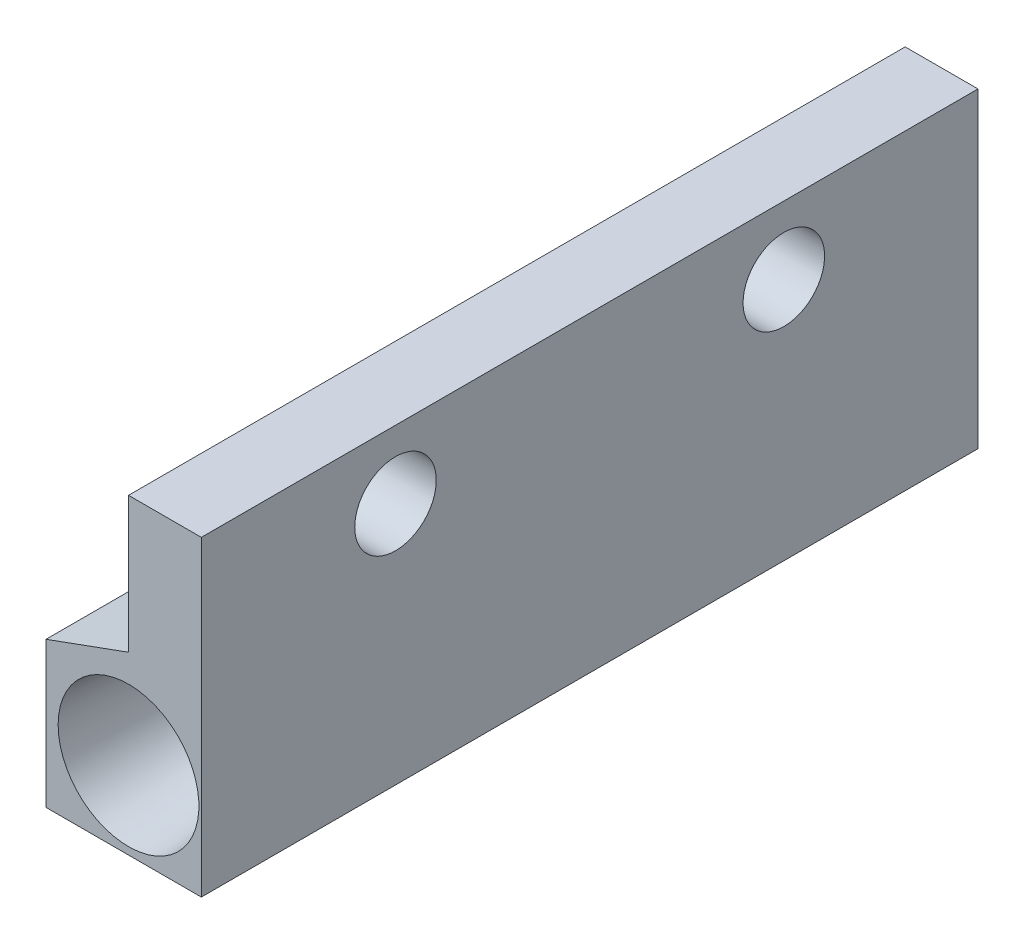
ISO-10303-21;
HEADER;
FILE_DESCRIPTION(('STEP AP214'),'2;1');
FILE_NAME('part.step','',(''),(''),'','','');
FILE_SCHEMA(('AUTOMOTIVE_DESIGN { 1 0 10303 214 1 1 1 1 }'));
ENDSEC;
DATA;
#1=APPLICATION_CONTEXT('core data for automotive mechanical design processes');
#2=APPLICATION_PROTOCOL_DEFINITION('international standard','automotive_design',2000,#1);
#3=PRODUCT_CONTEXT('',#1,'mechanical');
#4=PRODUCT('Part','Part','',(#3));
#5=PRODUCT_RELATED_PRODUCT_CATEGORY('part','',(#4));
#6=PRODUCT_DEFINITION_FORMATION('','',#4);
#7=PRODUCT_DEFINITION_CONTEXT('part definition',#1,'design');
#8=PRODUCT_DEFINITION('design','',#6,#7);
#9=PRODUCT_DEFINITION_SHAPE('','',#8);
#10=(LENGTH_UNIT() NAMED_UNIT(*) SI_UNIT(.MILLI.,.METRE.));
#11=(NAMED_UNIT(*) PLANE_ANGLE_UNIT() SI_UNIT($,.RADIAN.));
#12=(NAMED_UNIT(*) SI_UNIT($,.STERADIAN.) SOLID_ANGLE_UNIT());
#13=UNCERTAINTY_MEASURE_WITH_UNIT(LENGTH_MEASURE(1.E-05),#10,'distance_accuracy_value','');
#14=(GEOMETRIC_REPRESENTATION_CONTEXT(3) GLOBAL_UNCERTAINTY_ASSIGNED_CONTEXT((#13)) GLOBAL_UNIT_ASSIGNED_CONTEXT((#10,
#11,#12)) REPRESENTATION_CONTEXT('',''));
#15=CARTESIAN_POINT('',(0.,0.,0.));
#16=DIRECTION('',(0.,0.,1.));
#17=DIRECTION('',(1.,0.,0.));
#18=AXIS2_PLACEMENT_3D('',#15,#16,#17);
#19=CARTESIAN_POINT('',(0.,0.,40.));
#20=DIRECTION('',(0.,0.,-1.));
#21=DIRECTION('',(-1.,0.,0.));
#22=AXIS2_PLACEMENT_3D('',#19,#20,#21);
#23=PLANE('',#22);
#24=CARTESIAN_POINT('',(0.,0.,40.));
#25=DIRECTION('',(0.,0.,-1.));
#26=DIRECTION('',(-1.,0.,0.));
#27=AXIS2_PLACEMENT_3D('',#24,#25,#26);
#28=CIRCLE('',#27,3.62488663525925);
#29=CARTESIAN_POINT('',(-3.62488663525925,0.,40.));
#30=VERTEX_POINT('',#29);
#31=EDGE_CURVE('E140',#30,#30,#28,.T.);
#32=ORIENTED_EDGE('',*,*,#31,.T.);
#33=EDGE_LOOP('',(#32));
#34=FACE_BOUND('',#33,.T.);
#35=DIRECTION('',(0.,-1.,0.));
#36=VECTOR('',#35,1.);
#37=CARTESIAN_POINT('',(0.,5.04687349563135,40.));
#38=LINE('',#37,#36);
#39=CARTESIAN_POINT('',(0.,12.0468734956313,40.));
#40=VERTEX_POINT('',#39);
#41=CARTESIAN_POINT('',(0.,5.04687349563135,40.));
#42=VERTEX_POINT('',#41);
#43=EDGE_CURVE('E128',#40,#42,#38,.T.);
#44=ORIENTED_EDGE('',*,*,#43,.T.);
#45=DIRECTION('',(-0.939692620785909,-0.342020143325666,0.));
#46=VECTOR('',#45,1.);
#47=CARTESIAN_POINT('',(-4.25,3.5,40.));
#48=LINE('',#47,#46);
#49=CARTESIAN_POINT('',(-4.25,3.5,40.));
#50=VERTEX_POINT('',#49);
#51=EDGE_CURVE('E87',#42,#50,#48,.T.);
#52=ORIENTED_EDGE('',*,*,#51,.T.);
#53=DIRECTION('',(0.,-1.,0.));
#54=VECTOR('',#53,1.);
#55=CARTESIAN_POINT('',(-4.25,-4.,40.));
#56=LINE('',#55,#54);
#57=CARTESIAN_POINT('',(-4.25,-4.,40.));
#58=VERTEX_POINT('',#57);
#59=EDGE_CURVE('E99',#50,#58,#56,.T.);
#60=ORIENTED_EDGE('',*,*,#59,.T.);
#61=DIRECTION('',(1.,0.,0.));
#62=VECTOR('',#61,1.);
#63=CARTESIAN_POINT('',(-4.25,-4.,40.));
#64=LINE('',#63,#62);
#65=CARTESIAN_POINT('',(3.75,-4.,40.));
#66=VERTEX_POINT('',#65);
#67=EDGE_CURVE('E94',#58,#66,#64,.T.);
#68=ORIENTED_EDGE('',*,*,#67,.T.);
#69=DIRECTION('',(0.,1.,0.));
#70=VECTOR('',#69,1.);
#71=CARTESIAN_POINT('',(3.75,12.0468734956313,40.));
#72=LINE('',#71,#70);
#73=CARTESIAN_POINT('',(3.75,12.0468734956313,40.));
#74=VERTEX_POINT('',#73);
#75=EDGE_CURVE('E97',#66,#74,#72,.T.);
#76=ORIENTED_EDGE('',*,*,#75,.T.);
#77=DIRECTION('',(-1.,0.,0.));
#78=VECTOR('',#77,1.);
#79=CARTESIAN_POINT('',(0.,12.0468734956313,40.));
#80=LINE('',#79,#78);
#81=EDGE_CURVE('E49',#74,#40,#80,.T.);
#82=ORIENTED_EDGE('',*,*,#81,.T.);
#83=EDGE_LOOP('',(#44,#52,#60,#68,#76,#82));
#84=FACE_BOUND('',#83,.T.);
#85=ADVANCED_FACE('F32',(#34,#84),#23,.F.);
#86=CARTESIAN_POINT('',(0.,0.,0.));
#87=DIRECTION('',(0.,0.,-1.));
#88=DIRECTION('',(-1.,0.,0.));
#89=AXIS2_PLACEMENT_3D('',#86,#87,#88);
#90=PLANE('',#89);
#91=CARTESIAN_POINT('',(0.,0.,0.));
#92=DIRECTION('',(0.,0.,-1.));
#93=DIRECTION('',(-1.,0.,0.));
#94=AXIS2_PLACEMENT_3D('',#91,#92,#93);
#95=CIRCLE('',#94,3.62488663525923);
#96=CARTESIAN_POINT('',(-3.62488663525923,0.,0.));
#97=VERTEX_POINT('',#96);
#98=EDGE_CURVE('E41',#97,#97,#95,.F.);
#99=ORIENTED_EDGE('',*,*,#98,.T.);
#100=EDGE_LOOP('',(#99));
#101=FACE_BOUND('',#100,.T.);
#102=DIRECTION('',(0.,-1.,0.));
#103=VECTOR('',#102,1.);
#104=CARTESIAN_POINT('',(0.,5.04687349563135,0.));
#105=LINE('',#104,#103);
#106=CARTESIAN_POINT('',(0.,12.0468734956313,0.));
#107=VERTEX_POINT('',#106);
#108=CARTESIAN_POINT('',(0.,5.04687349563135,0.));
#109=VERTEX_POINT('',#108);
#110=EDGE_CURVE('E117',#107,#109,#105,.T.);
#111=ORIENTED_EDGE('',*,*,#110,.F.);
#112=DIRECTION('',(-1.,0.,0.));
#113=VECTOR('',#112,1.);
#114=CARTESIAN_POINT('',(0.,12.0468734956313,0.));
#115=LINE('',#114,#113);
#116=CARTESIAN_POINT('',(3.75,12.0468734956313,0.));
#117=VERTEX_POINT('',#116);
#118=EDGE_CURVE('E78',#117,#107,#115,.T.);
#119=ORIENTED_EDGE('',*,*,#118,.F.);
#120=DIRECTION('',(0.,1.,0.));
#121=VECTOR('',#120,1.);
#122=CARTESIAN_POINT('',(3.75,12.0468734956313,0.));
#123=LINE('',#122,#121);
#124=CARTESIAN_POINT('',(3.75,-4.,0.));
#125=VERTEX_POINT('',#124);
#126=EDGE_CURVE('E72',#125,#117,#123,.T.);
#127=ORIENTED_EDGE('',*,*,#126,.F.);
#128=DIRECTION('',(1.,0.,0.));
#129=VECTOR('',#128,1.);
#130=CARTESIAN_POINT('',(-4.25,-4.,0.));
#131=LINE('',#130,#129);
#132=CARTESIAN_POINT('',(-4.25,-4.,0.));
#133=VERTEX_POINT('',#132);
#134=EDGE_CURVE('E107',#133,#125,#131,.T.);
#135=ORIENTED_EDGE('',*,*,#134,.F.);
#136=DIRECTION('',(0.,-1.,0.));
#137=VECTOR('',#136,1.);
#138=CARTESIAN_POINT('',(-4.25,-4.,0.));
#139=LINE('',#138,#137);
#140=CARTESIAN_POINT('',(-4.25,3.5,0.));
#141=VERTEX_POINT('',#140);
#142=EDGE_CURVE('E123',#141,#133,#139,.T.);
#143=ORIENTED_EDGE('',*,*,#142,.F.);
#144=DIRECTION('',(-0.939692620785909,-0.342020143325666,0.));
#145=VECTOR('',#144,1.);
#146=CARTESIAN_POINT('',(-4.25,3.5,0.));
#147=LINE('',#146,#145);
#148=EDGE_CURVE('E120',#109,#141,#147,.T.);
#149=ORIENTED_EDGE('',*,*,#148,.F.);
#150=EDGE_LOOP('',(#111,#119,#127,#135,#143,#149));
#151=FACE_BOUND('',#150,.T.);
#152=ADVANCED_FACE('F145',(#101,#151),#90,.T.);
#153=CARTESIAN_POINT('',(0.,5.04687349563135,40.));
#154=DIRECTION('',(1.,0.,0.));
#155=DIRECTION('',(0.,1.,0.));
#156=AXIS2_PLACEMENT_3D('',#153,#154,#155);
#157=PLANE('',#156);
#158=CARTESIAN_POINT('',(0.,8.54687349563135,10.));
#159=DIRECTION('',(-1.,0.,0.));
#160=DIRECTION('',(0.,0.,1.));
#161=AXIS2_PLACEMENT_3D('',#158,#159,#160);
#162=CIRCLE('',#161,2.1);
#163=CARTESIAN_POINT('',(0.,8.54687349563135,12.1));
#164=VERTEX_POINT('',#163);
#165=EDGE_CURVE('E191',#164,#164,#162,.T.);
#166=ORIENTED_EDGE('',*,*,#165,.F.);
#167=EDGE_LOOP('',(#166));
#168=FACE_BOUND('',#167,.T.);
#169=CARTESIAN_POINT('',(0.,8.54687349563135,30.));
#170=DIRECTION('',(-1.,0.,0.));
#171=DIRECTION('',(0.,0.,1.));
#172=AXIS2_PLACEMENT_3D('',#169,#170,#171);
#173=CIRCLE('',#172,2.09999999999999);
#174=CARTESIAN_POINT('',(0.,8.54687349563135,32.1));
#175=VERTEX_POINT('',#174);
#176=EDGE_CURVE('E195',#175,#175,#173,.T.);
#177=ORIENTED_EDGE('',*,*,#176,.F.);
#178=EDGE_LOOP('',(#177));
#179=FACE_BOUND('',#178,.T.);
#180=ORIENTED_EDGE('',*,*,#110,.T.);
#181=DIRECTION('',(0.,0.,-1.));
#182=VECTOR('',#181,1.);
#183=CARTESIAN_POINT('',(0.,5.04687349563135,40.));
#184=LINE('',#183,#182);
#185=EDGE_CURVE('E135',#42,#109,#184,.T.);
#186=ORIENTED_EDGE('',*,*,#185,.F.);
#187=ORIENTED_EDGE('',*,*,#43,.F.);
#188=DIRECTION('',(0.,0.,-1.));
#189=VECTOR('',#188,1.);
#190=CARTESIAN_POINT('',(0.,12.0468734956313,40.));
#191=LINE('',#190,#189);
#192=EDGE_CURVE('E113',#40,#107,#191,.T.);
#193=ORIENTED_EDGE('',*,*,#192,.T.);
#194=EDGE_LOOP('',(#180,#186,#187,#193));
#195=FACE_BOUND('',#194,.T.);
#196=ADVANCED_FACE('F163',(#168,#179,#195),#157,.F.);
#197=CARTESIAN_POINT('',(-4.25,3.5,40.));
#198=DIRECTION('',(0.342020143325666,-0.939692620785909,0.));
#199=DIRECTION('',(0.93969262078591,0.342020143325666,0.));
#200=AXIS2_PLACEMENT_3D('',#197,#198,#199);
#201=PLANE('',#200);
#202=ORIENTED_EDGE('',*,*,#148,.T.);
#203=DIRECTION('',(0.,0.,-1.));
#204=VECTOR('',#203,1.);
#205=CARTESIAN_POINT('',(-4.25,3.5,40.));
#206=LINE('',#205,#204);
#207=EDGE_CURVE('E132',#50,#141,#206,.T.);
#208=ORIENTED_EDGE('',*,*,#207,.F.);
#209=ORIENTED_EDGE('',*,*,#51,.F.);
#210=ORIENTED_EDGE('',*,*,#185,.T.);
#211=EDGE_LOOP('',(#202,#208,#209,#210));
#212=FACE_BOUND('',#211,.T.);
#213=ADVANCED_FACE('F180',(#212),#201,.F.);
#214=CARTESIAN_POINT('',(-4.25,-4.,40.));
#215=DIRECTION('',(1.,0.,0.));
#216=DIRECTION('',(0.,1.,0.));
#217=AXIS2_PLACEMENT_3D('',#214,#215,#216);
#218=PLANE('',#217);
#219=ORIENTED_EDGE('',*,*,#142,.T.);
#220=DIRECTION('',(0.,0.,-1.));
#221=VECTOR('',#220,1.);
#222=CARTESIAN_POINT('',(-4.25,-4.,40.));
#223=LINE('',#222,#221);
#224=EDGE_CURVE('E108',#58,#133,#223,.T.);
#225=ORIENTED_EDGE('',*,*,#224,.F.);
#226=ORIENTED_EDGE('',*,*,#59,.F.);
#227=ORIENTED_EDGE('',*,*,#207,.T.);
#228=EDGE_LOOP('',(#219,#225,#226,#227));
#229=FACE_BOUND('',#228,.T.);
#230=ADVANCED_FACE('F177',(#229),#218,.F.);
#231=CARTESIAN_POINT('',(-4.25,-4.,40.));
#232=DIRECTION('',(0.,1.,0.));
#233=DIRECTION('',(0.,0.,1.));
#234=AXIS2_PLACEMENT_3D('',#231,#232,#233);
#235=PLANE('',#234);
#236=ORIENTED_EDGE('',*,*,#134,.T.);
#237=DIRECTION('',(0.,0.,-1.));
#238=VECTOR('',#237,1.);
#239=CARTESIAN_POINT('',(3.75,-4.,40.));
#240=LINE('',#239,#238);
#241=EDGE_CURVE('E104',#66,#125,#240,.T.);
#242=ORIENTED_EDGE('',*,*,#241,.F.);
#243=ORIENTED_EDGE('',*,*,#67,.F.);
#244=ORIENTED_EDGE('',*,*,#224,.T.);
#245=EDGE_LOOP('',(#236,#242,#243,#244));
#246=FACE_BOUND('',#245,.T.);
#247=ADVANCED_FACE('F105',(#246),#235,.F.);
#248=CARTESIAN_POINT('',(3.75,12.0468734956313,40.));
#249=DIRECTION('',(-1.,0.,0.));
#250=DIRECTION('',(0.,-1.,0.));
#251=AXIS2_PLACEMENT_3D('',#248,#249,#250);
#252=PLANE('',#251);
#253=CARTESIAN_POINT('',(3.75,8.54687349563135,10.));
#254=DIRECTION('',(-1.,0.,0.));
#255=DIRECTION('',(0.,0.,1.));
#256=AXIS2_PLACEMENT_3D('',#253,#254,#255);
#257=CIRCLE('',#256,2.1);
#258=CARTESIAN_POINT('',(3.75,8.54687349563135,12.1));
#259=VERTEX_POINT('',#258);
#260=EDGE_CURVE('E121',#259,#259,#257,.T.);
#261=ORIENTED_EDGE('',*,*,#260,.T.);
#262=EDGE_LOOP('',(#261));
#263=FACE_BOUND('',#262,.T.);
#264=CARTESIAN_POINT('',(3.75,8.54687349563135,30.));
#265=DIRECTION('',(-1.,0.,0.));
#266=DIRECTION('',(0.,0.,1.));
#267=AXIS2_PLACEMENT_3D('',#264,#265,#266);
#268=CIRCLE('',#267,2.09999999999999);
#269=CARTESIAN_POINT('',(3.75,8.54687349563135,32.1));
#270=VERTEX_POINT('',#269);
#271=EDGE_CURVE('E204',#270,#270,#268,.T.);
#272=ORIENTED_EDGE('',*,*,#271,.T.);
#273=EDGE_LOOP('',(#272));
#274=FACE_BOUND('',#273,.T.);
#275=ORIENTED_EDGE('',*,*,#126,.T.);
#276=DIRECTION('',(0.,0.,-1.));
#277=VECTOR('',#276,1.);
#278=CARTESIAN_POINT('',(3.75,12.0468734956313,40.));
#279=LINE('',#278,#277);
#280=EDGE_CURVE('E109',#74,#117,#279,.T.);
#281=ORIENTED_EDGE('',*,*,#280,.F.);
#282=ORIENTED_EDGE('',*,*,#75,.F.);
#283=ORIENTED_EDGE('',*,*,#241,.T.);
#284=EDGE_LOOP('',(#275,#281,#282,#283));
#285=FACE_BOUND('',#284,.T.);
#286=ADVANCED_FACE('F111',(#263,#274,#285),#252,.F.);
#287=CARTESIAN_POINT('',(0.,12.0468734956313,40.));
#288=DIRECTION('',(0.,-1.,0.));
#289=DIRECTION('',(0.,0.,-1.));
#290=AXIS2_PLACEMENT_3D('',#287,#288,#289);
#291=PLANE('',#290);
#292=ORIENTED_EDGE('',*,*,#118,.T.);
#293=ORIENTED_EDGE('',*,*,#192,.F.);
#294=ORIENTED_EDGE('',*,*,#81,.F.);
#295=ORIENTED_EDGE('',*,*,#280,.T.);
#296=EDGE_LOOP('',(#292,#293,#294,#295));
#297=FACE_BOUND('',#296,.T.);
#298=ADVANCED_FACE('F169',(#297),#291,.F.);
#299=CARTESIAN_POINT('',(0.,0.,40.));
#300=DIRECTION('',(0.,0.,-1.));
#301=DIRECTION('',(-1.,0.,0.));
#302=AXIS2_PLACEMENT_3D('',#299,#300,#301);
#303=CYLINDRICAL_SURFACE('',#302,2.75);
#304=CARTESIAN_POINT('',(0.,0.,10.0000000000003));
#305=DIRECTION('',(0.,0.,-1.));
#306=DIRECTION('',(-1.,0.,0.));
#307=AXIS2_PLACEMENT_3D('',#304,#305,#306);
#308=CIRCLE('',#307,2.75);
#309=CARTESIAN_POINT('',(-2.75,0.,10.0000000000003));
#310=VERTEX_POINT('',#309);
#311=EDGE_CURVE('E11',#310,#310,#308,.T.);
#312=ORIENTED_EDGE('',*,*,#311,.T.);
#313=EDGE_LOOP('',(#312));
#314=FACE_BOUND('',#313,.T.);
#315=CARTESIAN_POINT('',(0.,0.,29.9999999999995));
#316=DIRECTION('',(0.,0.,-1.));
#317=DIRECTION('',(-1.,0.,0.));
#318=AXIS2_PLACEMENT_3D('',#315,#316,#317);
#319=CIRCLE('',#318,2.75);
#320=CARTESIAN_POINT('',(-2.75,0.,29.9999999999995));
#321=VERTEX_POINT('',#320);
#322=EDGE_CURVE('E137',#321,#321,#319,.F.);
#323=ORIENTED_EDGE('',*,*,#322,.T.);
#324=EDGE_LOOP('',(#323));
#325=FACE_BOUND('',#324,.T.);
#326=ADVANCED_FACE('F166',(#314,#325),#303,.F.);
#327=CARTESIAN_POINT('',(3.75,8.54687349563135,30.));
#328=DIRECTION('',(-1.,0.,0.));
#329=DIRECTION('',(0.,0.,1.));
#330=AXIS2_PLACEMENT_3D('',#327,#328,#329);
#331=CYLINDRICAL_SURFACE('',#330,2.09999999999999);
#332=ORIENTED_EDGE('',*,*,#271,.F.);
#333=EDGE_LOOP('',(#332));
#334=FACE_BOUND('',#333,.T.);
#335=ORIENTED_EDGE('',*,*,#176,.T.);
#336=EDGE_LOOP('',(#335));
#337=FACE_BOUND('',#336,.T.);
#338=ADVANCED_FACE('F214',(#334,#337),#331,.F.);
#339=CARTESIAN_POINT('',(3.75,8.54687349563135,10.));
#340=DIRECTION('',(-1.,0.,0.));
#341=DIRECTION('',(0.,0.,1.));
#342=AXIS2_PLACEMENT_3D('',#339,#340,#341);
#343=CYLINDRICAL_SURFACE('',#342,2.1);
#344=ORIENTED_EDGE('',*,*,#260,.F.);
#345=EDGE_LOOP('',(#344));
#346=FACE_BOUND('',#345,.T.);
#347=ORIENTED_EDGE('',*,*,#165,.T.);
#348=EDGE_LOOP('',(#347));
#349=FACE_BOUND('',#348,.T.);
#350=ADVANCED_FACE('F154',(#346,#349),#343,.F.);
#351=CARTESIAN_POINT('',(0.,0.,29.9999999999995));
#352=DIRECTION('',(0.,0.,1.));
#353=DIRECTION('',(1.,0.,0.));
#354=AXIS2_PLACEMENT_3D('',#351,#352,#353);
#355=CONICAL_SURFACE('',#354,2.75,0.0872664625997131);
#356=ORIENTED_EDGE('',*,*,#31,.F.);
#357=EDGE_LOOP('',(#356));
#358=FACE_BOUND('',#357,.T.);
#359=ORIENTED_EDGE('',*,*,#322,.F.);
#360=EDGE_LOOP('',(#359));
#361=FACE_BOUND('',#360,.T.);
#362=ADVANCED_FACE('F149',(#358,#361),#355,.F.);
#363=CARTESIAN_POINT('',(0.,0.,0.));
#364=DIRECTION('',(0.,0.,-1.));
#365=DIRECTION('',(-1.,0.,0.));
#366=AXIS2_PLACEMENT_3D('',#363,#364,#365);
#367=CONICAL_SURFACE('',#366,3.62488663525923,0.0872664625997131);
#368=ORIENTED_EDGE('',*,*,#311,.F.);
#369=EDGE_LOOP('',(#368));
#370=FACE_BOUND('',#369,.T.);
#371=ORIENTED_EDGE('',*,*,#98,.F.);
#372=EDGE_LOOP('',(#371));
#373=FACE_BOUND('',#372,.T.);
#374=ADVANCED_FACE('F34',(#370,#373),#367,.F.);
#375=CLOSED_SHELL('',(#85,#152,#196,#213,#230,#247,#286,#298,#326,#338,#350,#362,#374));
#376=MANIFOLD_SOLID_BREP('B2',#375);
#377=ADVANCED_BREP_SHAPE_REPRESENTATION('',(#18,#376),#14);
#378=SHAPE_DEFINITION_REPRESENTATION(#9,#377);
ENDSEC;
END-ISO-10303-21;
